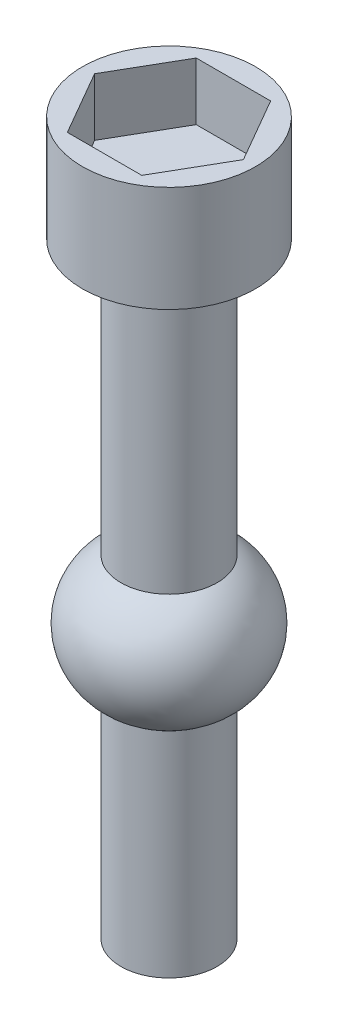
ISO-10303-21;
HEADER;
FILE_DESCRIPTION(('STEP AP214'),'2;1');
FILE_NAME('part.step','',(''),(''),'','','');
FILE_SCHEMA(('AUTOMOTIVE_DESIGN { 1 0 10303 214 1 1 1 1 }'));
ENDSEC;
DATA;
#1=APPLICATION_CONTEXT('core data for automotive mechanical design processes');
#2=APPLICATION_PROTOCOL_DEFINITION('international standard','automotive_design',2000,#1);
#3=PRODUCT_CONTEXT('',#1,'mechanical');
#4=PRODUCT('Part','Part','',(#3));
#5=PRODUCT_RELATED_PRODUCT_CATEGORY('part','',(#4));
#6=PRODUCT_DEFINITION_FORMATION('','',#4);
#7=PRODUCT_DEFINITION_CONTEXT('part definition',#1,'design');
#8=PRODUCT_DEFINITION('design','',#6,#7);
#9=PRODUCT_DEFINITION_SHAPE('','',#8);
#10=(LENGTH_UNIT() NAMED_UNIT(*) SI_UNIT(.MILLI.,.METRE.));
#11=(NAMED_UNIT(*) PLANE_ANGLE_UNIT() SI_UNIT($,.RADIAN.));
#12=(NAMED_UNIT(*) SI_UNIT($,.STERADIAN.) SOLID_ANGLE_UNIT());
#13=UNCERTAINTY_MEASURE_WITH_UNIT(LENGTH_MEASURE(1.E-05),#10,'distance_accuracy_value','');
#14=(GEOMETRIC_REPRESENTATION_CONTEXT(3) GLOBAL_UNCERTAINTY_ASSIGNED_CONTEXT((#13)) GLOBAL_UNIT_ASSIGNED_CONTEXT((#10,
#11,#12)) REPRESENTATION_CONTEXT('',''));
#15=CARTESIAN_POINT('',(0.,0.,0.));
#16=DIRECTION('',(0.,0.,1.));
#17=DIRECTION('',(1.,0.,0.));
#18=AXIS2_PLACEMENT_3D('',#15,#16,#17);
#19=CARTESIAN_POINT('',(0.,18.5,0.));
#20=DIRECTION('',(0.,-1.,0.));
#21=DIRECTION('',(0.,0.,-1.));
#22=AXIS2_PLACEMENT_3D('',#19,#20,#21);
#23=CYLINDRICAL_SURFACE('',#22,1.25);
#24=CARTESIAN_POINT('',(0.,8.63656263144071,0.));
#25=DIRECTION('',(0.,-1.,0.));
#26=DIRECTION('',(0.,0.,-1.));
#27=AXIS2_PLACEMENT_3D('',#24,#25,#26);
#28=CIRCLE('',#27,1.25);
#29=CARTESIAN_POINT('',(0.,8.63656263144071,-1.25));
#30=VERTEX_POINT('',#29);
#31=EDGE_CURVE('E137',#30,#30,#28,.T.);
#32=ORIENTED_EDGE('',*,*,#31,.F.);
#33=EDGE_LOOP('',(#32));
#34=FACE_BOUND('',#33,.T.);
#35=CARTESIAN_POINT('',(0.,15.75,0.));
#36=DIRECTION('',(0.,1.,0.));
#37=DIRECTION('',(0.,0.,1.));
#38=AXIS2_PLACEMENT_3D('',#35,#36,#37);
#39=CIRCLE('',#38,1.25);
#40=CARTESIAN_POINT('',(0.,15.75,1.25));
#41=VERTEX_POINT('',#40);
#42=EDGE_CURVE('E11',#41,#41,#39,.T.);
#43=ORIENTED_EDGE('',*,*,#42,.F.);
#44=EDGE_LOOP('',(#43));
#45=FACE_BOUND('',#44,.T.);
#46=ADVANCED_FACE('F36',(#34,#45),#23,.T.);
#47=CARTESIAN_POINT('',(0.,15.75,0.));
#48=DIRECTION('',(0.,1.,0.));
#49=DIRECTION('',(0.,0.,1.));
#50=AXIS2_PLACEMENT_3D('',#47,#48,#49);
#51=CYLINDRICAL_SURFACE('',#50,2.25);
#52=CARTESIAN_POINT('',(0.,15.75,0.));
#53=DIRECTION('',(0.,1.,0.));
#54=DIRECTION('',(0.,0.,1.));
#55=AXIS2_PLACEMENT_3D('',#52,#53,#54);
#56=CIRCLE('',#55,2.25);
#57=CARTESIAN_POINT('',(0.,15.75,2.25));
#58=VERTEX_POINT('',#57);
#59=EDGE_CURVE('E149',#58,#58,#56,.T.);
#60=ORIENTED_EDGE('',*,*,#59,.T.);
#61=EDGE_LOOP('',(#60));
#62=FACE_BOUND('',#61,.T.);
#63=CARTESIAN_POINT('',(0.,18.5,0.));
#64=DIRECTION('',(0.,1.,0.));
#65=DIRECTION('',(0.,0.,1.));
#66=AXIS2_PLACEMENT_3D('',#63,#64,#65);
#67=CIRCLE('',#66,2.25);
#68=CARTESIAN_POINT('',(0.,18.5,2.25));
#69=VERTEX_POINT('',#68);
#70=EDGE_CURVE('E148',#69,#69,#67,.T.);
#71=ORIENTED_EDGE('',*,*,#70,.F.);
#72=EDGE_LOOP('',(#71));
#73=FACE_BOUND('',#72,.T.);
#74=ADVANCED_FACE('F172',(#62,#73),#51,.T.);
#75=CARTESIAN_POINT('',(0.,15.75,0.));
#76=DIRECTION('',(0.,1.,0.));
#77=DIRECTION('',(0.,0.,1.));
#78=AXIS2_PLACEMENT_3D('',#75,#76,#77);
#79=PLANE('',#78);
#80=ORIENTED_EDGE('',*,*,#42,.T.);
#81=EDGE_LOOP('',(#80));
#82=FACE_BOUND('',#81,.T.);
#83=ORIENTED_EDGE('',*,*,#59,.F.);
#84=EDGE_LOOP('',(#83));
#85=FACE_BOUND('',#84,.T.);
#86=ADVANCED_FACE('F177',(#82,#85),#79,.F.);
#87=CARTESIAN_POINT('',(0.,18.5,0.));
#88=DIRECTION('',(0.,1.,0.));
#89=DIRECTION('',(0.,0.,1.));
#90=AXIS2_PLACEMENT_3D('',#87,#88,#89);
#91=PLANE('',#90);
#92=DIRECTION('',(-0.5,0.,-0.866025403784439));
#93=VECTOR('',#92,1.);
#94=CARTESIAN_POINT('',(1.933319803564,18.5,0.));
#95=LINE('',#94,#93);
#96=CARTESIAN_POINT('',(1.933319803564,18.5,0.));
#97=VERTEX_POINT('',#96);
#98=CARTESIAN_POINT('',(0.966659901781999,18.5,-1.67430406352596));
#99=VERTEX_POINT('',#98);
#100=EDGE_CURVE('E50',#97,#99,#95,.T.);
#101=ORIENTED_EDGE('',*,*,#100,.F.);
#102=DIRECTION('',(0.5,0.,-0.866025403784439));
#103=VECTOR('',#102,1.);
#104=CARTESIAN_POINT('',(0.966659901781999,18.5,1.67430406352596));
#105=LINE('',#104,#103);
#106=CARTESIAN_POINT('',(0.966659901781999,18.5,1.67430406352596));
#107=VERTEX_POINT('',#106);
#108=EDGE_CURVE('E133',#107,#97,#105,.T.);
#109=ORIENTED_EDGE('',*,*,#108,.F.);
#110=DIRECTION('',(1.,0.,0.));
#111=VECTOR('',#110,1.);
#112=CARTESIAN_POINT('',(-0.966659901781999,18.5,1.67430406352596));
#113=LINE('',#112,#111);
#114=CARTESIAN_POINT('',(-0.966659901781999,18.5,1.67430406352596));
#115=VERTEX_POINT('',#114);
#116=EDGE_CURVE('E131',#115,#107,#113,.T.);
#117=ORIENTED_EDGE('',*,*,#116,.F.);
#118=DIRECTION('',(0.5,0.,0.866025403784438));
#119=VECTOR('',#118,1.);
#120=CARTESIAN_POINT('',(-1.933319803564,18.5,0.));
#121=LINE('',#120,#119);
#122=CARTESIAN_POINT('',(-1.933319803564,18.5,0.));
#123=VERTEX_POINT('',#122);
#124=EDGE_CURVE('E98',#123,#115,#121,.T.);
#125=ORIENTED_EDGE('',*,*,#124,.F.);
#126=DIRECTION('',(-0.5,0.,0.866025403784439));
#127=VECTOR('',#126,1.);
#128=CARTESIAN_POINT('',(-0.966659901781999,18.5,-1.67430406352596));
#129=LINE('',#128,#127);
#130=CARTESIAN_POINT('',(-0.966659901781999,18.5,-1.67430406352596));
#131=VERTEX_POINT('',#130);
#132=EDGE_CURVE('E127',#131,#123,#129,.T.);
#133=ORIENTED_EDGE('',*,*,#132,.F.);
#134=DIRECTION('',(-1.,0.,0.));
#135=VECTOR('',#134,1.);
#136=CARTESIAN_POINT('',(0.966659901781999,18.5,-1.67430406352596));
#137=LINE('',#136,#135);
#138=EDGE_CURVE('E124',#99,#131,#137,.T.);
#139=ORIENTED_EDGE('',*,*,#138,.F.);
#140=EDGE_LOOP('',(#101,#109,#117,#125,#133,#139));
#141=FACE_BOUND('',#140,.T.);
#142=ORIENTED_EDGE('',*,*,#70,.T.);
#143=EDGE_LOOP('',(#142));
#144=FACE_BOUND('',#143,.T.);
#145=ADVANCED_FACE('F167',(#141,#144),#91,.T.);
#146=CARTESIAN_POINT('',(0.,7.10672991625887,0.));
#147=DIRECTION('',(0.,-1.,0.));
#148=DIRECTION('',(0.,0.,-1.));
#149=AXIS2_PLACEMENT_3D('',#146,#147,#148);
#150=DEGENERATE_TOROIDAL_SURFACE('',#149,0.434883274400109,1.73343687880272,.T.);
#151=ORIENTED_EDGE('',*,*,#31,.T.);
#152=EDGE_LOOP('',(#151));
#153=FACE_BOUND('',#152,.T.);
#154=CARTESIAN_POINT('',(0.,5.57689720107703,0.));
#155=DIRECTION('',(0.,-1.,0.));
#156=DIRECTION('',(0.,0.,-1.));
#157=AXIS2_PLACEMENT_3D('',#154,#155,#156);
#158=CIRCLE('',#157,1.25);
#159=CARTESIAN_POINT('',(0.,5.57689720107703,-1.25));
#160=VERTEX_POINT('',#159);
#161=EDGE_CURVE('E145',#160,#160,#158,.T.);
#162=ORIENTED_EDGE('',*,*,#161,.F.);
#163=EDGE_LOOP('',(#162));
#164=FACE_BOUND('',#163,.T.);
#165=ADVANCED_FACE('F160',(#153,#164),#150,.T.);
#166=CARTESIAN_POINT('',(0.,0.,0.));
#167=DIRECTION('',(0.,1.,0.));
#168=DIRECTION('',(0.,0.,1.));
#169=AXIS2_PLACEMENT_3D('',#166,#167,#168);
#170=PLANE('',#169);
#171=CARTESIAN_POINT('',(0.,0.,0.));
#172=DIRECTION('',(0.,1.,0.));
#173=DIRECTION('',(0.,0.,1.));
#174=AXIS2_PLACEMENT_3D('',#171,#172,#173);
#175=CIRCLE('',#174,1.25);
#176=CARTESIAN_POINT('',(0.,0.,1.25));
#177=VERTEX_POINT('',#176);
#178=EDGE_CURVE('E43',#177,#177,#175,.T.);
#179=ORIENTED_EDGE('',*,*,#178,.F.);
#180=EDGE_LOOP('',(#179));
#181=FACE_BOUND('',#180,.T.);
#182=ADVANCED_FACE('F158',(#181),#170,.F.);
#183=ORIENTED_EDGE('',*,*,#161,.T.);
#184=EDGE_LOOP('',(#183));
#185=FACE_BOUND('',#184,.T.);
#186=ORIENTED_EDGE('',*,*,#178,.T.);
#187=EDGE_LOOP('',(#186));
#188=FACE_BOUND('',#187,.T.);
#189=ADVANCED_FACE('F156',(#185,#188),#23,.T.);
#190=CARTESIAN_POINT('',(1.933319803564,17.,0.));
#191=DIRECTION('',(0.866025403784439,0.,-0.5));
#192=DIRECTION('',(-0.5,0.,-0.866025403784439));
#193=AXIS2_PLACEMENT_3D('',#190,#191,#192);
#194=PLANE('',#193);
#195=ORIENTED_EDGE('',*,*,#100,.T.);
#196=DIRECTION('',(0.,1.,0.));
#197=VECTOR('',#196,1.);
#198=CARTESIAN_POINT('',(0.966659901781999,17.,-1.67430406352596));
#199=LINE('',#198,#197);
#200=CARTESIAN_POINT('',(0.966659901781999,17.,-1.67430406352596));
#201=VERTEX_POINT('',#200);
#202=EDGE_CURVE('E80',#201,#99,#199,.T.);
#203=ORIENTED_EDGE('',*,*,#202,.F.);
#204=DIRECTION('',(-0.5,0.,-0.866025403784439));
#205=VECTOR('',#204,1.);
#206=CARTESIAN_POINT('',(1.933319803564,17.,0.));
#207=LINE('',#206,#205);
#208=CARTESIAN_POINT('',(1.933319803564,17.,0.));
#209=VERTEX_POINT('',#208);
#210=EDGE_CURVE('E135',#209,#201,#207,.T.);
#211=ORIENTED_EDGE('',*,*,#210,.F.);
#212=DIRECTION('',(0.,1.,0.));
#213=VECTOR('',#212,1.);
#214=CARTESIAN_POINT('',(1.933319803564,17.,0.));
#215=LINE('',#214,#213);
#216=EDGE_CURVE('E58',#209,#97,#215,.T.);
#217=ORIENTED_EDGE('',*,*,#216,.T.);
#218=EDGE_LOOP('',(#195,#203,#211,#217));
#219=FACE_BOUND('',#218,.T.);
#220=ADVANCED_FACE('F165',(#219),#194,.F.);
#221=CARTESIAN_POINT('',(0.966659901781999,17.,1.67430406352596));
#222=DIRECTION('',(0.866025403784439,0.,0.5));
#223=DIRECTION('',(0.5,0.,-0.866025403784439));
#224=AXIS2_PLACEMENT_3D('',#221,#222,#223);
#225=PLANE('',#224);
#226=ORIENTED_EDGE('',*,*,#108,.T.);
#227=ORIENTED_EDGE('',*,*,#216,.F.);
#228=DIRECTION('',(0.5,0.,-0.866025403784439));
#229=VECTOR('',#228,1.);
#230=CARTESIAN_POINT('',(0.966659901781999,17.,1.67430406352596));
#231=LINE('',#230,#229);
#232=CARTESIAN_POINT('',(0.966659901781999,17.,1.67430406352596));
#233=VERTEX_POINT('',#232);
#234=EDGE_CURVE('E110',#233,#209,#231,.T.);
#235=ORIENTED_EDGE('',*,*,#234,.F.);
#236=DIRECTION('',(0.,1.,0.));
#237=VECTOR('',#236,1.);
#238=CARTESIAN_POINT('',(0.966659901781999,17.,1.67430406352596));
#239=LINE('',#238,#237);
#240=EDGE_CURVE('E102',#233,#107,#239,.T.);
#241=ORIENTED_EDGE('',*,*,#240,.T.);
#242=EDGE_LOOP('',(#226,#227,#235,#241));
#243=FACE_BOUND('',#242,.T.);
#244=ADVANCED_FACE('F198',(#243),#225,.F.);
#245=CARTESIAN_POINT('',(-0.966659901781999,17.,1.67430406352596));
#246=DIRECTION('',(0.,0.,1.));
#247=DIRECTION('',(1.,0.,0.));
#248=AXIS2_PLACEMENT_3D('',#245,#246,#247);
#249=PLANE('',#248);
#250=ORIENTED_EDGE('',*,*,#116,.T.);
#251=ORIENTED_EDGE('',*,*,#240,.F.);
#252=DIRECTION('',(1.,0.,0.));
#253=VECTOR('',#252,1.);
#254=CARTESIAN_POINT('',(-0.966659901781999,17.,1.67430406352596));
#255=LINE('',#254,#253);
#256=CARTESIAN_POINT('',(-0.966659901781999,17.,1.67430406352596));
#257=VERTEX_POINT('',#256);
#258=EDGE_CURVE('E106',#257,#233,#255,.T.);
#259=ORIENTED_EDGE('',*,*,#258,.F.);
#260=DIRECTION('',(0.,1.,0.));
#261=VECTOR('',#260,1.);
#262=CARTESIAN_POINT('',(-0.966659901781999,17.,1.67430406352596));
#263=LINE('',#262,#261);
#264=EDGE_CURVE('E91',#257,#115,#263,.T.);
#265=ORIENTED_EDGE('',*,*,#264,.T.);
#266=EDGE_LOOP('',(#250,#251,#259,#265));
#267=FACE_BOUND('',#266,.T.);
#268=ADVANCED_FACE('F107',(#267),#249,.F.);
#269=CARTESIAN_POINT('',(-1.933319803564,17.,0.));
#270=DIRECTION('',(-0.866025403784439,0.,0.5));
#271=DIRECTION('',(0.5,0.,0.866025403784439));
#272=AXIS2_PLACEMENT_3D('',#269,#270,#271);
#273=PLANE('',#272);
#274=ORIENTED_EDGE('',*,*,#124,.T.);
#275=ORIENTED_EDGE('',*,*,#264,.F.);
#276=DIRECTION('',(0.5,0.,0.866025403784438));
#277=VECTOR('',#276,1.);
#278=CARTESIAN_POINT('',(-1.933319803564,17.,0.));
#279=LINE('',#278,#277);
#280=CARTESIAN_POINT('',(-1.933319803564,17.,0.));
#281=VERTEX_POINT('',#280);
#282=EDGE_CURVE('E95',#281,#257,#279,.T.);
#283=ORIENTED_EDGE('',*,*,#282,.F.);
#284=DIRECTION('',(0.,1.,0.));
#285=VECTOR('',#284,1.);
#286=CARTESIAN_POINT('',(-1.933319803564,17.,0.));
#287=LINE('',#286,#285);
#288=EDGE_CURVE('E103',#281,#123,#287,.T.);
#289=ORIENTED_EDGE('',*,*,#288,.T.);
#290=EDGE_LOOP('',(#274,#275,#283,#289));
#291=FACE_BOUND('',#290,.T.);
#292=ADVANCED_FACE('F93',(#291),#273,.F.);
#293=CARTESIAN_POINT('',(-0.966659901781999,17.,-1.67430406352596));
#294=DIRECTION('',(-0.866025403784439,0.,-0.5));
#295=DIRECTION('',(-0.5,0.,0.866025403784439));
#296=AXIS2_PLACEMENT_3D('',#293,#294,#295);
#297=PLANE('',#296);
#298=ORIENTED_EDGE('',*,*,#132,.T.);
#299=ORIENTED_EDGE('',*,*,#288,.F.);
#300=DIRECTION('',(-0.5,0.,0.866025403784439));
#301=VECTOR('',#300,1.);
#302=CARTESIAN_POINT('',(-0.966659901781999,17.,-1.67430406352596));
#303=LINE('',#302,#301);
#304=CARTESIAN_POINT('',(-0.966659901781999,17.,-1.67430406352596));
#305=VERTEX_POINT('',#304);
#306=EDGE_CURVE('E116',#305,#281,#303,.T.);
#307=ORIENTED_EDGE('',*,*,#306,.F.);
#308=DIRECTION('',(0.,1.,0.));
#309=VECTOR('',#308,1.);
#310=CARTESIAN_POINT('',(-0.966659901781999,17.,-1.67430406352596));
#311=LINE('',#310,#309);
#312=EDGE_CURVE('E140',#305,#131,#311,.T.);
#313=ORIENTED_EDGE('',*,*,#312,.T.);
#314=EDGE_LOOP('',(#298,#299,#307,#313));
#315=FACE_BOUND('',#314,.T.);
#316=ADVANCED_FACE('F202',(#315),#297,.F.);
#317=CARTESIAN_POINT('',(0.966659901781999,17.,-1.67430406352596));
#318=DIRECTION('',(0.,0.,-1.));
#319=DIRECTION('',(-1.,0.,0.));
#320=AXIS2_PLACEMENT_3D('',#317,#318,#319);
#321=PLANE('',#320);
#322=ORIENTED_EDGE('',*,*,#138,.T.);
#323=ORIENTED_EDGE('',*,*,#312,.F.);
#324=DIRECTION('',(-1.,0.,0.));
#325=VECTOR('',#324,1.);
#326=CARTESIAN_POINT('',(0.966659901781999,17.,-1.67430406352596));
#327=LINE('',#326,#325);
#328=EDGE_CURVE('E118',#201,#305,#327,.T.);
#329=ORIENTED_EDGE('',*,*,#328,.F.);
#330=ORIENTED_EDGE('',*,*,#202,.T.);
#331=EDGE_LOOP('',(#322,#323,#329,#330));
#332=FACE_BOUND('',#331,.T.);
#333=ADVANCED_FACE('F199',(#332),#321,.F.);
#334=CARTESIAN_POINT('',(0.,17.,0.));
#335=DIRECTION('',(0.,1.,0.));
#336=DIRECTION('',(0.,0.,1.));
#337=AXIS2_PLACEMENT_3D('',#334,#335,#336);
#338=PLANE('',#337);
#339=ORIENTED_EDGE('',*,*,#210,.T.);
#340=ORIENTED_EDGE('',*,*,#328,.T.);
#341=ORIENTED_EDGE('',*,*,#306,.T.);
#342=ORIENTED_EDGE('',*,*,#282,.T.);
#343=ORIENTED_EDGE('',*,*,#258,.T.);
#344=ORIENTED_EDGE('',*,*,#234,.T.);
#345=EDGE_LOOP('',(#339,#340,#341,#342,#343,#344));
#346=FACE_BOUND('',#345,.T.);
#347=ADVANCED_FACE('F113',(#346),#338,.T.);
#348=CLOSED_SHELL('',(#46,#74,#86,#145,#165,#182,#189,#220,#244,#268,#292,#316,#333,#347));
#349=MANIFOLD_SOLID_BREP('B2',#348);
#350=ADVANCED_BREP_SHAPE_REPRESENTATION('',(#18,#349),#14);
#351=SHAPE_DEFINITION_REPRESENTATION(#9,#350);
ENDSEC;
END-ISO-10303-21;
